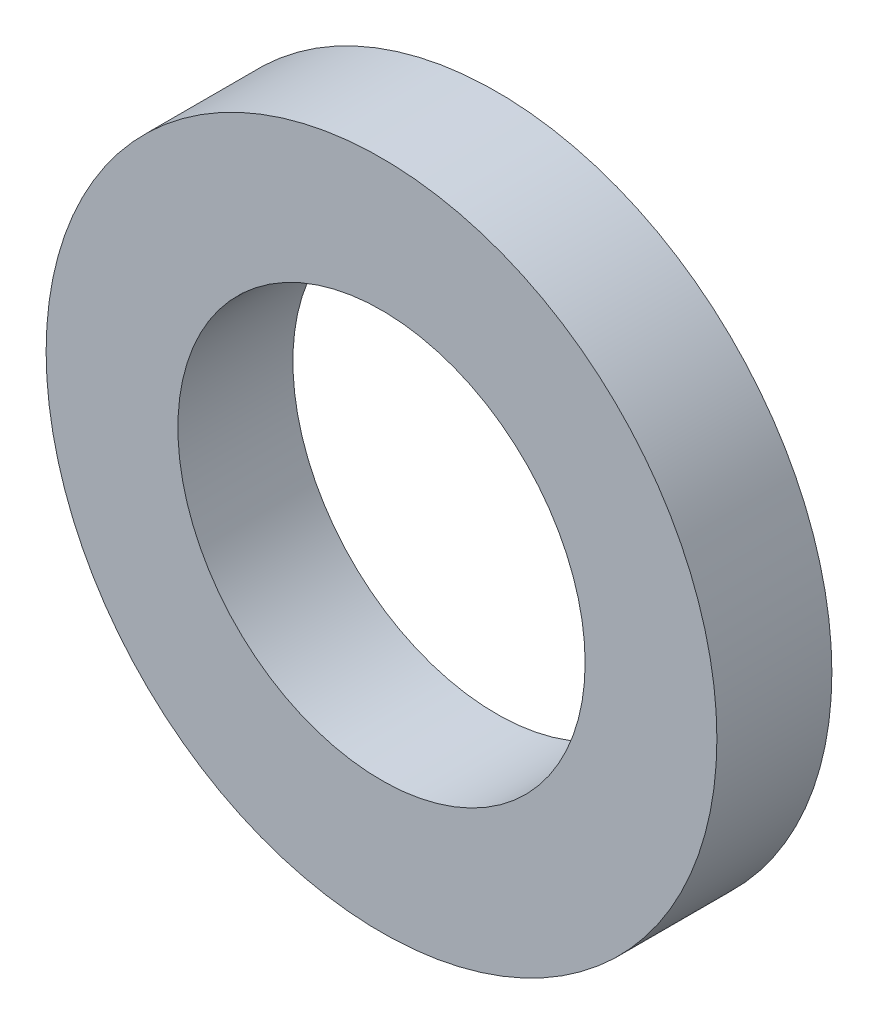
ISO-10303-21;
HEADER;
FILE_DESCRIPTION(('STEP AP214'),'2;1');
FILE_NAME('part.step','',(''),(''),'','','');
FILE_SCHEMA(('AUTOMOTIVE_DESIGN { 1 0 10303 214 1 1 1 1 }'));
ENDSEC;
DATA;
#1=APPLICATION_CONTEXT('core data for automotive mechanical design processes');
#2=APPLICATION_PROTOCOL_DEFINITION('international standard','automotive_design',2000,#1);
#3=PRODUCT_CONTEXT('',#1,'mechanical');
#4=PRODUCT('Part','Part','',(#3));
#5=PRODUCT_RELATED_PRODUCT_CATEGORY('part','',(#4));
#6=PRODUCT_DEFINITION_FORMATION('','',#4);
#7=PRODUCT_DEFINITION_CONTEXT('part definition',#1,'design');
#8=PRODUCT_DEFINITION('design','',#6,#7);
#9=PRODUCT_DEFINITION_SHAPE('','',#8);
#10=(LENGTH_UNIT() NAMED_UNIT(*) SI_UNIT(.MILLI.,.METRE.));
#11=(NAMED_UNIT(*) PLANE_ANGLE_UNIT() SI_UNIT($,.RADIAN.));
#12=(NAMED_UNIT(*) SI_UNIT($,.STERADIAN.) SOLID_ANGLE_UNIT());
#13=UNCERTAINTY_MEASURE_WITH_UNIT(LENGTH_MEASURE(1.E-05),#10,'distance_accuracy_value','');
#14=(GEOMETRIC_REPRESENTATION_CONTEXT(3) GLOBAL_UNCERTAINTY_ASSIGNED_CONTEXT((#13)) GLOBAL_UNIT_ASSIGNED_CONTEXT((#10,
#11,#12)) REPRESENTATION_CONTEXT('',''));
#15=CARTESIAN_POINT('',(0.,0.,0.));
#16=DIRECTION('',(0.,0.,1.));
#17=DIRECTION('',(1.,0.,0.));
#18=AXIS2_PLACEMENT_3D('',#15,#16,#17);
#19=CARTESIAN_POINT('',(0.,0.,2.4));
#20=DIRECTION('',(0.,0.,1.));
#21=DIRECTION('',(1.,0.,0.));
#22=AXIS2_PLACEMENT_3D('',#19,#20,#21);
#23=PLANE('',#22);
#24=CARTESIAN_POINT('',(0.,0.,2.4));
#25=DIRECTION('',(0.,0.,1.));
#26=DIRECTION('',(1.,0.,0.));
#27=AXIS2_PLACEMENT_3D('',#24,#25,#26);
#28=CIRCLE('',#27,7.);
#29=CARTESIAN_POINT('',(7.,0.,2.4));
#30=VERTEX_POINT('',#29);
#31=EDGE_CURVE('E10',#30,#30,#28,.T.);
#32=ORIENTED_EDGE('',*,*,#31,.T.);
#33=EDGE_LOOP('',(#32));
#34=FACE_BOUND('',#33,.T.);
#35=CARTESIAN_POINT('',(0.,0.,2.4));
#36=DIRECTION('',(0.,0.,1.));
#37=DIRECTION('',(1.,0.,0.));
#38=AXIS2_PLACEMENT_3D('',#35,#36,#37);
#39=CIRCLE('',#38,4.25);
#40=CARTESIAN_POINT('',(4.25,0.,2.4));
#41=VERTEX_POINT('',#40);
#42=EDGE_CURVE('E42',#41,#41,#39,.T.);
#43=ORIENTED_EDGE('',*,*,#42,.F.);
#44=EDGE_LOOP('',(#43));
#45=FACE_BOUND('',#44,.T.);
#46=ADVANCED_FACE('F31',(#34,#45),#23,.T.);
#47=CARTESIAN_POINT('',(0.,0.,0.));
#48=DIRECTION('',(0.,0.,1.));
#49=DIRECTION('',(1.,0.,0.));
#50=AXIS2_PLACEMENT_3D('',#47,#48,#49);
#51=PLANE('',#50);
#52=CARTESIAN_POINT('',(0.,0.,0.));
#53=DIRECTION('',(0.,0.,1.));
#54=DIRECTION('',(1.,0.,0.));
#55=AXIS2_PLACEMENT_3D('',#52,#53,#54);
#56=CIRCLE('',#55,7.);
#57=CARTESIAN_POINT('',(7.,0.,0.));
#58=VERTEX_POINT('',#57);
#59=EDGE_CURVE('E35',#58,#58,#56,.T.);
#60=ORIENTED_EDGE('',*,*,#59,.F.);
#61=EDGE_LOOP('',(#60));
#62=FACE_BOUND('',#61,.T.);
#63=CARTESIAN_POINT('',(0.,0.,0.));
#64=DIRECTION('',(0.,0.,1.));
#65=DIRECTION('',(1.,0.,0.));
#66=AXIS2_PLACEMENT_3D('',#63,#64,#65);
#67=CIRCLE('',#66,4.25);
#68=CARTESIAN_POINT('',(4.25,0.,0.));
#69=VERTEX_POINT('',#68);
#70=EDGE_CURVE('E44',#69,#69,#67,.T.);
#71=ORIENTED_EDGE('',*,*,#70,.T.);
#72=EDGE_LOOP('',(#71));
#73=FACE_BOUND('',#72,.T.);
#74=ADVANCED_FACE('F54',(#62,#73),#51,.F.);
#75=CARTESIAN_POINT('',(0.,0.,2.4));
#76=DIRECTION('',(0.,0.,-1.));
#77=DIRECTION('',(-1.,0.,0.));
#78=AXIS2_PLACEMENT_3D('',#75,#76,#77);
#79=CYLINDRICAL_SURFACE('',#78,7.);
#80=ORIENTED_EDGE('',*,*,#31,.F.);
#81=EDGE_LOOP('',(#80));
#82=FACE_BOUND('',#81,.T.);
#83=ORIENTED_EDGE('',*,*,#59,.T.);
#84=EDGE_LOOP('',(#83));
#85=FACE_BOUND('',#84,.T.);
#86=ADVANCED_FACE('F33',(#82,#85),#79,.T.);
#87=CARTESIAN_POINT('',(0.,0.,2.4));
#88=DIRECTION('',(0.,0.,-1.));
#89=DIRECTION('',(-1.,0.,0.));
#90=AXIS2_PLACEMENT_3D('',#87,#88,#89);
#91=CYLINDRICAL_SURFACE('',#90,4.25);
#92=ORIENTED_EDGE('',*,*,#42,.T.);
#93=EDGE_LOOP('',(#92));
#94=FACE_BOUND('',#93,.T.);
#95=ORIENTED_EDGE('',*,*,#70,.F.);
#96=EDGE_LOOP('',(#95));
#97=FACE_BOUND('',#96,.T.);
#98=ADVANCED_FACE('F50',(#94,#97),#91,.F.);
#99=CLOSED_SHELL('',(#46,#74,#86,#98));
#100=MANIFOLD_SOLID_BREP('B2',#99);
#101=ADVANCED_BREP_SHAPE_REPRESENTATION('',(#18,#100),#14);
#102=SHAPE_DEFINITION_REPRESENTATION(#9,#101);
ENDSEC;
END-ISO-10303-21;
